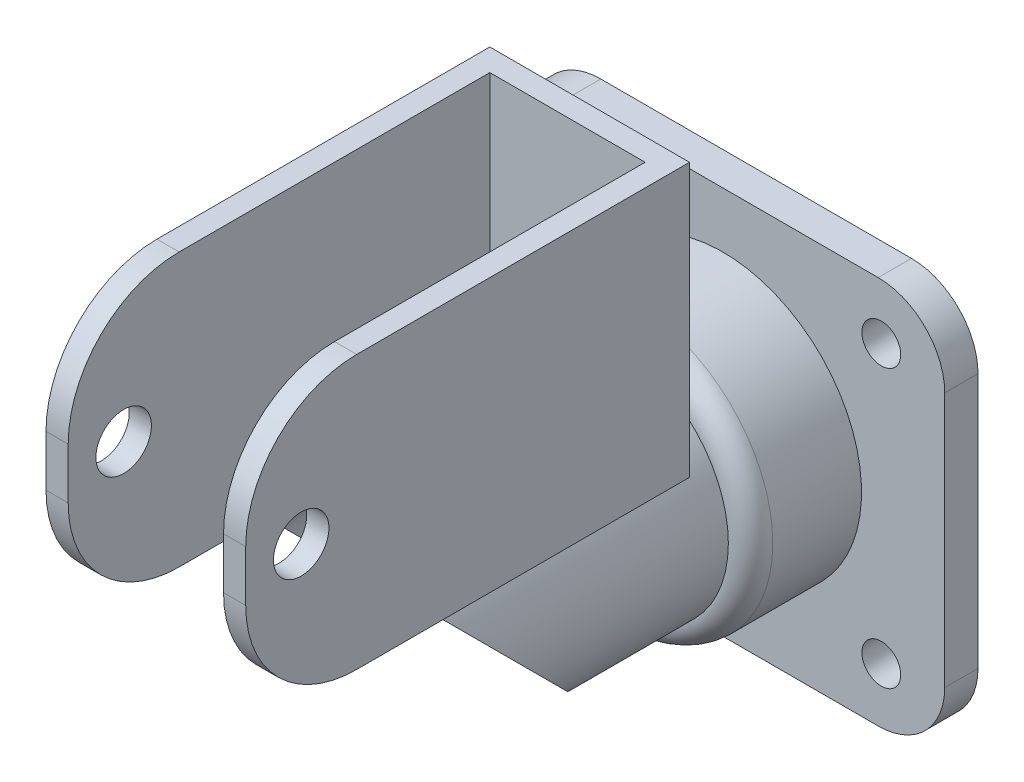
ISO-10303-21;
HEADER;
FILE_DESCRIPTION(('STEP AP214'),'2;1');
FILE_NAME('part.step','',(''),(''),'','','');
FILE_SCHEMA(('AUTOMOTIVE_DESIGN { 1 0 10303 214 1 1 1 1 }'));
ENDSEC;
DATA;
#1=APPLICATION_CONTEXT('core data for automotive mechanical design processes');
#2=APPLICATION_PROTOCOL_DEFINITION('international standard','automotive_design',2000,#1);
#3=PRODUCT_CONTEXT('',#1,'mechanical');
#4=PRODUCT('Part','Part','',(#3));
#5=PRODUCT_RELATED_PRODUCT_CATEGORY('part','',(#4));
#6=PRODUCT_DEFINITION_FORMATION('','',#4);
#7=PRODUCT_DEFINITION_CONTEXT('part definition',#1,'design');
#8=PRODUCT_DEFINITION('design','',#6,#7);
#9=PRODUCT_DEFINITION_SHAPE('','',#8);
#10=(LENGTH_UNIT() NAMED_UNIT(*) SI_UNIT(.MILLI.,.METRE.));
#11=(NAMED_UNIT(*) PLANE_ANGLE_UNIT() SI_UNIT($,.RADIAN.));
#12=(NAMED_UNIT(*) SI_UNIT($,.STERADIAN.) SOLID_ANGLE_UNIT());
#13=UNCERTAINTY_MEASURE_WITH_UNIT(LENGTH_MEASURE(1.E-05),#10,'distance_accuracy_value','');
#14=(GEOMETRIC_REPRESENTATION_CONTEXT(3) GLOBAL_UNCERTAINTY_ASSIGNED_CONTEXT((#13)) GLOBAL_UNIT_ASSIGNED_CONTEXT((#10,
#11,#12)) REPRESENTATION_CONTEXT('',''));
#15=CARTESIAN_POINT('',(0.,0.,0.));
#16=DIRECTION('',(0.,0.,1.));
#17=DIRECTION('',(1.,0.,0.));
#18=AXIS2_PLACEMENT_3D('',#15,#16,#17);
#19=CARTESIAN_POINT('',(-9.,1.99999999999999,55.));
#20=DIRECTION('',(0.,0.,1.));
#21=DIRECTION('',(1.,0.,0.));
#22=AXIS2_PLACEMENT_3D('',#19,#20,#21);
#23=PLANE('',#22);
#24=DIRECTION('',(0.,1.,0.));
#25=VECTOR('',#24,1.);
#26=CARTESIAN_POINT('',(-7.,1.99999999999999,55.));
#27=LINE('',#26,#25);
#28=CARTESIAN_POINT('',(-7.,15.408326913196,55.));
#29=VERTEX_POINT('',#28);
#30=CARTESIAN_POINT('',(-7.,20.,55.));
#31=VERTEX_POINT('',#30);
#32=EDGE_CURVE('E243',#29,#31,#27,.T.);
#33=ORIENTED_EDGE('',*,*,#32,.T.);
#34=DIRECTION('',(1.,0.,0.));
#35=VECTOR('',#34,1.);
#36=CARTESIAN_POINT('',(-9.,20.,55.));
#37=LINE('',#36,#35);
#38=CARTESIAN_POINT('',(-9.,20.,55.));
#39=VERTEX_POINT('',#38);
#40=EDGE_CURVE('E397',#31,#39,#37,.F.);
#41=ORIENTED_EDGE('',*,*,#40,.T.);
#42=DIRECTION('',(0.,1.,0.));
#43=VECTOR('',#42,1.);
#44=CARTESIAN_POINT('',(-9.,1.99999999999999,55.));
#45=LINE('',#44,#43);
#46=CARTESIAN_POINT('',(-9.,15.408326913196,55.));
#47=VERTEX_POINT('',#46);
#48=EDGE_CURVE('E271',#47,#39,#45,.T.);
#49=ORIENTED_EDGE('',*,*,#48,.F.);
#50=DIRECTION('',(1.,0.,0.));
#51=VECTOR('',#50,1.);
#52=CARTESIAN_POINT('',(-9.,15.408326913196,55.));
#53=LINE('',#52,#51);
#54=EDGE_CURVE('E394',#47,#29,#53,.T.);
#55=ORIENTED_EDGE('',*,*,#54,.T.);
#56=EDGE_LOOP('',(#33,#41,#49,#55));
#57=FACE_BOUND('',#56,.T.);
#58=ADVANCED_FACE('F40',(#57),#23,.T.);
#59=CARTESIAN_POINT('',(-20.,5.40832691319601,0.));
#60=DIRECTION('',(0.,-1.,0.));
#61=DIRECTION('',(0.,0.,-1.));
#62=AXIS2_PLACEMENT_3D('',#59,#60,#61);
#63=PLANE('',#62);
#64=DIRECTION('',(0.,0.,-1.));
#65=VECTOR('',#64,1.);
#66=CARTESIAN_POINT('',(8.99999999999999,5.40832691319601,15.));
#67=LINE('',#66,#65);
#68=CARTESIAN_POINT('',(9.,5.40832691319599,45.));
#69=VERTEX_POINT('',#68);
#70=CARTESIAN_POINT('',(8.99999999999999,5.408326913196,37.2220354121809));
#71=VERTEX_POINT('',#70);
#72=EDGE_CURVE('E258',#69,#71,#67,.T.);
#73=ORIENTED_EDGE('',*,*,#72,.F.);
#74=DIRECTION('',(1.,0.,0.));
#75=VECTOR('',#74,1.);
#76=CARTESIAN_POINT('',(-20.,5.40832691319599,45.));
#77=LINE('',#76,#75);
#78=CARTESIAN_POINT('',(7.,5.40832691319599,45.));
#79=VERTEX_POINT('',#78);
#80=EDGE_CURVE('E49',#69,#79,#77,.F.);
#81=ORIENTED_EDGE('',*,*,#80,.T.);
#82=DIRECTION('',(0.,0.,-1.));
#83=VECTOR('',#82,1.);
#84=CARTESIAN_POINT('',(6.99999999999999,5.40832691319601,15.));
#85=LINE('',#84,#83);
#86=CARTESIAN_POINT('',(7.,5.408326913196,37.2220354121809));
#87=VERTEX_POINT('',#86);
#88=EDGE_CURVE('E239',#79,#87,#85,.T.);
#89=ORIENTED_EDGE('',*,*,#88,.T.);
#90=DIRECTION('',(1.,0.,0.));
#91=VECTOR('',#90,1.);
#92=CARTESIAN_POINT('',(-20.,5.408326913196,37.2220354121809));
#93=LINE('',#92,#91);
#94=EDGE_CURVE('E253',#87,#71,#93,.T.);
#95=ORIENTED_EDGE('',*,*,#94,.T.);
#96=EDGE_LOOP('',(#73,#81,#89,#95));
#97=FACE_BOUND('',#96,.T.);
#98=ADVANCED_FACE('F434',(#97),#63,.T.);
#99=DIRECTION('',(0.,0.,1.));
#100=VECTOR('',#99,1.);
#101=CARTESIAN_POINT('',(-7.00000000000001,5.40832691319601,15.));
#102=LINE('',#101,#100);
#103=CARTESIAN_POINT('',(-7.,5.408326913196,37.2220354121809));
#104=VERTEX_POINT('',#103);
#105=CARTESIAN_POINT('',(-7.,5.40832691319599,45.));
#106=VERTEX_POINT('',#105);
#107=EDGE_CURVE('E235',#104,#106,#102,.T.);
#108=ORIENTED_EDGE('',*,*,#107,.T.);
#109=DIRECTION('',(1.,0.,0.));
#110=VECTOR('',#109,1.);
#111=CARTESIAN_POINT('',(-20.,5.40832691319599,45.));
#112=LINE('',#111,#110);
#113=CARTESIAN_POINT('',(-9.,5.40832691319599,45.));
#114=VERTEX_POINT('',#113);
#115=EDGE_CURVE('E12',#106,#114,#112,.F.);
#116=ORIENTED_EDGE('',*,*,#115,.T.);
#117=DIRECTION('',(0.,0.,1.));
#118=VECTOR('',#117,1.);
#119=CARTESIAN_POINT('',(-9.00000000000001,5.40832691319601,15.));
#120=LINE('',#119,#118);
#121=CARTESIAN_POINT('',(-9.00000000000001,5.408326913196,37.2220354121809));
#122=VERTEX_POINT('',#121);
#123=EDGE_CURVE('E260',#122,#114,#120,.T.);
#124=ORIENTED_EDGE('',*,*,#123,.F.);
#125=EDGE_CURVE('E255',#122,#104,#93,.T.);
#126=ORIENTED_EDGE('',*,*,#125,.T.);
#127=EDGE_LOOP('',(#108,#116,#124,#126));
#128=FACE_BOUND('',#127,.T.);
#129=ADVANCED_FACE('F464',(#128),#63,.T.);
#130=CARTESIAN_POINT('',(-9.00000000000001,1.99999999999999,15.));
#131=DIRECTION('',(-1.,0.,0.));
#132=DIRECTION('',(0.,0.,1.));
#133=AXIS2_PLACEMENT_3D('',#130,#131,#132);
#134=PLANE('',#133);
#135=CARTESIAN_POINT('',(-9.,17.704163456598,50.));
#136=DIRECTION('',(-1.,0.,0.));
#137=DIRECTION('',(0.,0.,1.));
#138=AXIS2_PLACEMENT_3D('',#135,#136,#137);
#139=CIRCLE('',#138,2.5);
#140=CARTESIAN_POINT('',(-9.,17.704163456598,52.5));
#141=VERTEX_POINT('',#140);
#142=EDGE_CURVE('E230',#141,#141,#139,.T.);
#143=ORIENTED_EDGE('',*,*,#142,.F.);
#144=EDGE_LOOP('',(#143));
#145=FACE_BOUND('',#144,.T.);
#146=ORIENTED_EDGE('',*,*,#48,.T.);
#147=CARTESIAN_POINT('',(-9.,20.,45.));
#148=DIRECTION('',(-1.,0.,0.));
#149=DIRECTION('',(0.,0.,1.));
#150=AXIS2_PLACEMENT_3D('',#147,#148,#149);
#151=CIRCLE('',#150,10.);
#152=CARTESIAN_POINT('',(-9.,30.,45.));
#153=VERTEX_POINT('',#152);
#154=EDGE_CURVE('E401',#39,#153,#151,.T.);
#155=ORIENTED_EDGE('',*,*,#154,.T.);
#156=DIRECTION('',(0.,0.,1.));
#157=VECTOR('',#156,1.);
#158=CARTESIAN_POINT('',(-9.00000000000001,30.,15.));
#159=LINE('',#158,#157);
#160=CARTESIAN_POINT('',(-9.00000000000001,30.,15.));
#161=VERTEX_POINT('',#160);
#162=EDGE_CURVE('E263',#161,#153,#159,.T.);
#163=ORIENTED_EDGE('',*,*,#162,.F.);
#164=DIRECTION('',(0.,1.,0.));
#165=VECTOR('',#164,1.);
#166=CARTESIAN_POINT('',(-9.00000000000001,1.99999999999999,15.));
#167=LINE('',#166,#165);
#168=CARTESIAN_POINT('',(-9.00000000000001,5.40832691319597,15.));
#169=VERTEX_POINT('',#168);
#170=EDGE_CURVE('E272',#169,#161,#167,.T.);
#171=ORIENTED_EDGE('',*,*,#170,.F.);
#172=DIRECTION('',(0.,0.,-1.));
#173=VECTOR('',#172,1.);
#174=CARTESIAN_POINT('',(-9.,5.40832691319598,43.));
#175=LINE('',#174,#173);
#176=EDGE_CURVE('E284',#122,#169,#175,.T.);
#177=ORIENTED_EDGE('',*,*,#176,.F.);
#178=ORIENTED_EDGE('',*,*,#123,.T.);
#179=CARTESIAN_POINT('',(-9.,15.408326913196,45.));
#180=DIRECTION('',(-1.,0.,0.));
#181=DIRECTION('',(0.,0.,1.));
#182=AXIS2_PLACEMENT_3D('',#179,#180,#181);
#183=CIRCLE('',#182,10.);
#184=EDGE_CURVE('E399',#114,#47,#183,.T.);
#185=ORIENTED_EDGE('',*,*,#184,.T.);
#186=EDGE_LOOP('',(#146,#155,#163,#171,#177,#178,#185));
#187=FACE_BOUND('',#186,.T.);
#188=ADVANCED_FACE('F465',(#145,#187),#134,.T.);
#189=CARTESIAN_POINT('',(8.99999999999999,1.99999999999999,15.));
#190=DIRECTION('',(1.,0.,0.));
#191=DIRECTION('',(0.,0.,-1.));
#192=AXIS2_PLACEMENT_3D('',#189,#190,#191);
#193=PLANE('',#192);
#194=CARTESIAN_POINT('',(9.,17.704163456598,50.));
#195=DIRECTION('',(1.,0.,0.));
#196=DIRECTION('',(0.,0.,-1.));
#197=AXIS2_PLACEMENT_3D('',#194,#195,#196);
#198=CIRCLE('',#197,2.5);
#199=CARTESIAN_POINT('',(9.,17.704163456598,47.5));
#200=VERTEX_POINT('',#199);
#201=EDGE_CURVE('E810',#200,#200,#198,.T.);
#202=ORIENTED_EDGE('',*,*,#201,.F.);
#203=EDGE_LOOP('',(#202));
#204=FACE_BOUND('',#203,.T.);
#205=DIRECTION('',(0.,0.,-1.));
#206=VECTOR('',#205,1.);
#207=CARTESIAN_POINT('',(8.99999999999999,30.,15.));
#208=LINE('',#207,#206);
#209=CARTESIAN_POINT('',(9.,30.,45.));
#210=VERTEX_POINT('',#209);
#211=CARTESIAN_POINT('',(8.99999999999999,30.,15.));
#212=VERTEX_POINT('',#211);
#213=EDGE_CURVE('E266',#210,#212,#208,.T.);
#214=ORIENTED_EDGE('',*,*,#213,.F.);
#215=CARTESIAN_POINT('',(9.,20.,45.));
#216=DIRECTION('',(1.,0.,0.));
#217=DIRECTION('',(0.,0.,-1.));
#218=AXIS2_PLACEMENT_3D('',#215,#216,#217);
#219=CIRCLE('',#218,10.);
#220=CARTESIAN_POINT('',(9.,20.,55.));
#221=VERTEX_POINT('',#220);
#222=EDGE_CURVE('E405',#210,#221,#219,.T.);
#223=ORIENTED_EDGE('',*,*,#222,.T.);
#224=DIRECTION('',(0.,1.,0.));
#225=VECTOR('',#224,1.);
#226=CARTESIAN_POINT('',(9.,1.99999999999999,55.));
#227=LINE('',#226,#225);
#228=CARTESIAN_POINT('',(9.,15.408326913196,55.));
#229=VERTEX_POINT('',#228);
#230=EDGE_CURVE('E278',#229,#221,#227,.T.);
#231=ORIENTED_EDGE('',*,*,#230,.F.);
#232=CARTESIAN_POINT('',(9.,15.408326913196,45.));
#233=DIRECTION('',(1.,0.,0.));
#234=DIRECTION('',(0.,0.,-1.));
#235=AXIS2_PLACEMENT_3D('',#232,#233,#234);
#236=CIRCLE('',#235,10.);
#237=EDGE_CURVE('E403',#229,#69,#236,.T.);
#238=ORIENTED_EDGE('',*,*,#237,.T.);
#239=ORIENTED_EDGE('',*,*,#72,.T.);
#240=DIRECTION('',(0.,0.,-1.));
#241=VECTOR('',#240,1.);
#242=CARTESIAN_POINT('',(9.,5.40832691319599,43.));
#243=LINE('',#242,#241);
#244=CARTESIAN_POINT('',(8.99999999999999,5.40832691319599,15.));
#245=VERTEX_POINT('',#244);
#246=EDGE_CURVE('E274',#245,#71,#243,.F.);
#247=ORIENTED_EDGE('',*,*,#246,.F.);
#248=DIRECTION('',(0.,1.,0.));
#249=VECTOR('',#248,1.);
#250=CARTESIAN_POINT('',(8.99999999999999,1.99999999999999,15.));
#251=LINE('',#250,#249);
#252=EDGE_CURVE('E275',#245,#212,#251,.T.);
#253=ORIENTED_EDGE('',*,*,#252,.T.);
#254=EDGE_LOOP('',(#214,#223,#231,#238,#239,#247,#253));
#255=FACE_BOUND('',#254,.T.);
#256=ADVANCED_FACE('F427',(#204,#255),#193,.T.);
#257=ORIENTED_EDGE('',*,*,#230,.T.);
#258=DIRECTION('',(1.,0.,0.));
#259=VECTOR('',#258,1.);
#260=CARTESIAN_POINT('',(-9.,20.,55.));
#261=LINE('',#260,#259);
#262=CARTESIAN_POINT('',(7.,20.,55.));
#263=VERTEX_POINT('',#262);
#264=EDGE_CURVE('E63',#221,#263,#261,.F.);
#265=ORIENTED_EDGE('',*,*,#264,.T.);
#266=DIRECTION('',(0.,1.,0.));
#267=VECTOR('',#266,1.);
#268=CARTESIAN_POINT('',(7.,1.99999999999999,55.));
#269=LINE('',#268,#267);
#270=CARTESIAN_POINT('',(7.,15.408326913196,55.));
#271=VERTEX_POINT('',#270);
#272=EDGE_CURVE('E234',#271,#263,#269,.T.);
#273=ORIENTED_EDGE('',*,*,#272,.F.);
#274=DIRECTION('',(1.,0.,0.));
#275=VECTOR('',#274,1.);
#276=CARTESIAN_POINT('',(-9.,15.408326913196,55.));
#277=LINE('',#276,#275);
#278=EDGE_CURVE('E407',#271,#229,#277,.T.);
#279=ORIENTED_EDGE('',*,*,#278,.T.);
#280=EDGE_LOOP('',(#257,#265,#273,#279));
#281=FACE_BOUND('',#280,.T.);
#282=ADVANCED_FACE('F428',(#281),#23,.T.);
#283=CARTESIAN_POINT('',(0.,0.,43.));
#284=DIRECTION('',(0.,0.,-1.));
#285=DIRECTION('',(-1.,0.,0.));
#286=AXIS2_PLACEMENT_3D('',#283,#284,#285);
#287=CYLINDRICAL_SURFACE('',#286,10.5);
#288=CARTESIAN_POINT('',(0.,0.,13.));
#289=DIRECTION('',(0.,0.,1.));
#290=DIRECTION('',(1.,0.,0.));
#291=AXIS2_PLACEMENT_3D('',#288,#289,#290);
#292=CIRCLE('',#291,10.5);
#293=CARTESIAN_POINT('',(10.5,0.,13.));
#294=VERTEX_POINT('',#293);
#295=EDGE_CURVE('E372',#294,#294,#292,.T.);
#296=ORIENTED_EDGE('',*,*,#295,.T.);
#297=EDGE_LOOP('',(#296));
#298=FACE_BOUND('',#297,.T.);
#299=CARTESIAN_POINT('',(0.,0.,31.8137084989849));
#300=DIRECTION('',(0.,-0.707106781186549,0.707106781186546));
#301=DIRECTION('',(0.,-0.707106781186546,-0.707106781186549));
#302=AXIS2_PLACEMENT_3D('',#299,#300,#301);
#303=ELLIPSE('',#302,14.8492424049175,10.5);
#304=EDGE_CURVE('E378',#122,#71,#303,.T.);
#305=ORIENTED_EDGE('',*,*,#304,.F.);
#306=ORIENTED_EDGE('',*,*,#176,.T.);
#307=CARTESIAN_POINT('',(0.,0.,15.));
#308=DIRECTION('',(0.,0.,-1.));
#309=DIRECTION('',(-1.,0.,0.));
#310=AXIS2_PLACEMENT_3D('',#307,#308,#309);
#311=CIRCLE('',#310,10.5);
#312=EDGE_CURVE('E381',#169,#245,#311,.T.);
#313=ORIENTED_EDGE('',*,*,#312,.T.);
#314=ORIENTED_EDGE('',*,*,#246,.T.);
#315=EDGE_LOOP('',(#305,#306,#313,#314));
#316=FACE_BOUND('',#315,.T.);
#317=ADVANCED_FACE('F443',(#298,#316),#287,.T.);
#318=CARTESIAN_POINT('',(14.,11.5,3.));
#319=DIRECTION('',(0.,0.,-1.));
#320=DIRECTION('',(-1.,0.,0.));
#321=AXIS2_PLACEMENT_3D('',#318,#319,#320);
#322=PLANE('',#321);
#323=CARTESIAN_POINT('',(0.,0.,3.));
#324=DIRECTION('',(0.,0.,-1.));
#325=DIRECTION('',(-1.,0.,0.));
#326=AXIS2_PLACEMENT_3D('',#323,#324,#325);
#327=CIRCLE('',#326,12.5);
#328=CARTESIAN_POINT('',(-12.5,0.,3.));
#329=VERTEX_POINT('',#328);
#330=EDGE_CURVE('E369',#329,#329,#327,.F.);
#331=ORIENTED_EDGE('',*,*,#330,.F.);
#332=EDGE_LOOP('',(#331));
#333=FACE_BOUND('',#332,.T.);
#334=CARTESIAN_POINT('',(14.,11.5,3.));
#335=DIRECTION('',(0.,0.,1.));
#336=DIRECTION('',(-1.,0.,0.));
#337=AXIS2_PLACEMENT_3D('',#334,#335,#336);
#338=CIRCLE('',#337,6.);
#339=CARTESIAN_POINT('',(20.,11.5,3.));
#340=VERTEX_POINT('',#339);
#341=CARTESIAN_POINT('',(14.,17.5,3.));
#342=VERTEX_POINT('',#341);
#343=EDGE_CURVE('E312',#340,#342,#338,.T.);
#344=ORIENTED_EDGE('',*,*,#343,.T.);
#345=DIRECTION('',(-1.,0.,0.));
#346=VECTOR('',#345,1.);
#347=CARTESIAN_POINT('',(-14.,17.5,3.));
#348=LINE('',#347,#346);
#349=CARTESIAN_POINT('',(-14.,17.5,3.));
#350=VERTEX_POINT('',#349);
#351=EDGE_CURVE('E315',#342,#350,#348,.T.);
#352=ORIENTED_EDGE('',*,*,#351,.T.);
#353=CARTESIAN_POINT('',(-14.,11.5,3.));
#354=DIRECTION('',(0.,0.,1.));
#355=DIRECTION('',(-1.,0.,0.));
#356=AXIS2_PLACEMENT_3D('',#353,#354,#355);
#357=CIRCLE('',#356,6.);
#358=CARTESIAN_POINT('',(-20.,11.5,3.));
#359=VERTEX_POINT('',#358);
#360=EDGE_CURVE('E318',#350,#359,#357,.T.);
#361=ORIENTED_EDGE('',*,*,#360,.T.);
#362=DIRECTION('',(0.,-1.,0.));
#363=VECTOR('',#362,1.);
#364=CARTESIAN_POINT('',(-20.,-11.5,3.));
#365=LINE('',#364,#363);
#366=CARTESIAN_POINT('',(-20.,-11.5,3.));
#367=VERTEX_POINT('',#366);
#368=EDGE_CURVE('E320',#359,#367,#365,.T.);
#369=ORIENTED_EDGE('',*,*,#368,.T.);
#370=CARTESIAN_POINT('',(-14.,-11.5,3.));
#371=DIRECTION('',(0.,0.,1.));
#372=DIRECTION('',(-1.,0.,0.));
#373=AXIS2_PLACEMENT_3D('',#370,#371,#372);
#374=CIRCLE('',#373,6.);
#375=CARTESIAN_POINT('',(-14.,-17.5,3.));
#376=VERTEX_POINT('',#375);
#377=EDGE_CURVE('E322',#367,#376,#374,.T.);
#378=ORIENTED_EDGE('',*,*,#377,.T.);
#379=DIRECTION('',(1.,0.,0.));
#380=VECTOR('',#379,1.);
#381=CARTESIAN_POINT('',(-14.,-17.5,3.));
#382=LINE('',#381,#380);
#383=CARTESIAN_POINT('',(14.,-17.5,3.));
#384=VERTEX_POINT('',#383);
#385=EDGE_CURVE('E324',#376,#384,#382,.T.);
#386=ORIENTED_EDGE('',*,*,#385,.T.);
#387=CARTESIAN_POINT('',(14.,-11.5,3.));
#388=DIRECTION('',(0.,0.,1.));
#389=DIRECTION('',(1.,0.,0.));
#390=AXIS2_PLACEMENT_3D('',#387,#388,#389);
#391=CIRCLE('',#390,6.);
#392=CARTESIAN_POINT('',(20.,-11.5,3.));
#393=VERTEX_POINT('',#392);
#394=EDGE_CURVE('E326',#384,#393,#391,.T.);
#395=ORIENTED_EDGE('',*,*,#394,.T.);
#396=DIRECTION('',(0.,1.,0.));
#397=VECTOR('',#396,1.);
#398=CARTESIAN_POINT('',(20.,-11.5,3.));
#399=LINE('',#398,#397);
#400=EDGE_CURVE('E328',#393,#340,#399,.T.);
#401=ORIENTED_EDGE('',*,*,#400,.T.);
#402=EDGE_LOOP('',(#344,#352,#361,#369,#378,#386,#395,#401));
#403=FACE_BOUND('',#402,.T.);
#404=CARTESIAN_POINT('',(-14.2857142857143,12.5,3.));
#405=DIRECTION('',(0.,0.,1.));
#406=DIRECTION('',(1.,0.,0.));
#407=AXIS2_PLACEMENT_3D('',#404,#405,#406);
#408=CIRCLE('',#407,1.75);
#409=CARTESIAN_POINT('',(-12.5357142857143,12.5,3.));
#410=VERTEX_POINT('',#409);
#411=EDGE_CURVE('E306',#410,#410,#408,.T.);
#412=ORIENTED_EDGE('',*,*,#411,.F.);
#413=EDGE_LOOP('',(#412));
#414=FACE_BOUND('',#413,.T.);
#415=CARTESIAN_POINT('',(-14.2857142857143,-12.5,3.));
#416=DIRECTION('',(0.,0.,1.));
#417=DIRECTION('',(1.,0.,0.));
#418=AXIS2_PLACEMENT_3D('',#415,#416,#417);
#419=CIRCLE('',#418,1.75);
#420=CARTESIAN_POINT('',(-12.5357142857143,-12.5,3.));
#421=VERTEX_POINT('',#420);
#422=EDGE_CURVE('E300',#421,#421,#419,.T.);
#423=ORIENTED_EDGE('',*,*,#422,.F.);
#424=EDGE_LOOP('',(#423));
#425=FACE_BOUND('',#424,.T.);
#426=CARTESIAN_POINT('',(14.2857142857143,-12.5,3.));
#427=DIRECTION('',(0.,0.,1.));
#428=DIRECTION('',(1.,0.,0.));
#429=AXIS2_PLACEMENT_3D('',#426,#427,#428);
#430=CIRCLE('',#429,1.75);
#431=CARTESIAN_POINT('',(16.0357142857143,-12.5,3.));
#432=VERTEX_POINT('',#431);
#433=EDGE_CURVE('E294',#432,#432,#430,.T.);
#434=ORIENTED_EDGE('',*,*,#433,.F.);
#435=EDGE_LOOP('',(#434));
#436=FACE_BOUND('',#435,.T.);
#437=CARTESIAN_POINT('',(14.2857142857143,12.5,3.));
#438=DIRECTION('',(0.,0.,1.));
#439=DIRECTION('',(1.,0.,0.));
#440=AXIS2_PLACEMENT_3D('',#437,#438,#439);
#441=CIRCLE('',#440,1.75);
#442=CARTESIAN_POINT('',(16.0357142857143,12.5,3.));
#443=VERTEX_POINT('',#442);
#444=EDGE_CURVE('E288',#443,#443,#441,.T.);
#445=ORIENTED_EDGE('',*,*,#444,.F.);
#446=EDGE_LOOP('',(#445));
#447=FACE_BOUND('',#446,.T.);
#448=ADVANCED_FACE('F487',(#333,#403,#414,#425,#436,#447),#322,.F.);
#449=CARTESIAN_POINT('',(14.,11.5,0.));
#450=DIRECTION('',(0.,0.,-1.));
#451=DIRECTION('',(-1.,0.,0.));
#452=AXIS2_PLACEMENT_3D('',#449,#450,#451);
#453=PLANE('',#452);
#454=CARTESIAN_POINT('',(14.2857142857143,-12.5,0.));
#455=DIRECTION('',(0.,0.,1.));
#456=DIRECTION('',(1.,0.,0.));
#457=AXIS2_PLACEMENT_3D('',#454,#455,#456);
#458=CIRCLE('',#457,1.75);
#459=CARTESIAN_POINT('',(16.0357142857143,-12.5,0.));
#460=VERTEX_POINT('',#459);
#461=EDGE_CURVE('E291',#460,#460,#458,.T.);
#462=ORIENTED_EDGE('',*,*,#461,.T.);
#463=EDGE_LOOP('',(#462));
#464=FACE_BOUND('',#463,.T.);
#465=CARTESIAN_POINT('',(-14.2857142857143,12.5,0.));
#466=DIRECTION('',(0.,0.,1.));
#467=DIRECTION('',(1.,0.,0.));
#468=AXIS2_PLACEMENT_3D('',#465,#466,#467);
#469=CIRCLE('',#468,1.75);
#470=CARTESIAN_POINT('',(-12.5357142857143,12.5,0.));
#471=VERTEX_POINT('',#470);
#472=EDGE_CURVE('E303',#471,#471,#469,.T.);
#473=ORIENTED_EDGE('',*,*,#472,.T.);
#474=EDGE_LOOP('',(#473));
#475=FACE_BOUND('',#474,.T.);
#476=CARTESIAN_POINT('',(14.,11.5,0.));
#477=DIRECTION('',(0.,0.,1.));
#478=DIRECTION('',(-1.,0.,0.));
#479=AXIS2_PLACEMENT_3D('',#476,#477,#478);
#480=CIRCLE('',#479,6.);
#481=CARTESIAN_POINT('',(20.,11.5,0.));
#482=VERTEX_POINT('',#481);
#483=CARTESIAN_POINT('',(14.,17.5,0.));
#484=VERTEX_POINT('',#483);
#485=EDGE_CURVE('E309',#482,#484,#480,.T.);
#486=ORIENTED_EDGE('',*,*,#485,.F.);
#487=DIRECTION('',(0.,1.,0.));
#488=VECTOR('',#487,1.);
#489=CARTESIAN_POINT('',(20.,-11.5,0.));
#490=LINE('',#489,#488);
#491=CARTESIAN_POINT('',(20.,-11.5,0.));
#492=VERTEX_POINT('',#491);
#493=EDGE_CURVE('E316',#492,#482,#490,.T.);
#494=ORIENTED_EDGE('',*,*,#493,.F.);
#495=CARTESIAN_POINT('',(14.,-11.5,0.));
#496=DIRECTION('',(0.,0.,1.));
#497=DIRECTION('',(1.,0.,0.));
#498=AXIS2_PLACEMENT_3D('',#495,#496,#497);
#499=CIRCLE('',#498,6.);
#500=CARTESIAN_POINT('',(14.,-17.5,0.));
#501=VERTEX_POINT('',#500);
#502=EDGE_CURVE('E343',#501,#492,#499,.T.);
#503=ORIENTED_EDGE('',*,*,#502,.F.);
#504=DIRECTION('',(1.,0.,0.));
#505=VECTOR('',#504,1.);
#506=CARTESIAN_POINT('',(-14.,-17.5,0.));
#507=LINE('',#506,#505);
#508=CARTESIAN_POINT('',(-14.,-17.5,0.));
#509=VERTEX_POINT('',#508);
#510=EDGE_CURVE('E341',#509,#501,#507,.T.);
#511=ORIENTED_EDGE('',*,*,#510,.F.);
#512=CARTESIAN_POINT('',(-14.,-11.5,0.));
#513=DIRECTION('',(0.,0.,1.));
#514=DIRECTION('',(-1.,0.,0.));
#515=AXIS2_PLACEMENT_3D('',#512,#513,#514);
#516=CIRCLE('',#515,6.);
#517=CARTESIAN_POINT('',(-20.,-11.5,0.));
#518=VERTEX_POINT('',#517);
#519=EDGE_CURVE('E339',#518,#509,#516,.T.);
#520=ORIENTED_EDGE('',*,*,#519,.F.);
#521=DIRECTION('',(0.,-1.,0.));
#522=VECTOR('',#521,1.);
#523=CARTESIAN_POINT('',(-20.,-11.5,0.));
#524=LINE('',#523,#522);
#525=CARTESIAN_POINT('',(-20.,11.5,0.));
#526=VERTEX_POINT('',#525);
#527=EDGE_CURVE('E337',#526,#518,#524,.T.);
#528=ORIENTED_EDGE('',*,*,#527,.F.);
#529=CARTESIAN_POINT('',(-14.,11.5,0.));
#530=DIRECTION('',(0.,0.,1.));
#531=DIRECTION('',(-1.,0.,0.));
#532=AXIS2_PLACEMENT_3D('',#529,#530,#531);
#533=CIRCLE('',#532,6.);
#534=CARTESIAN_POINT('',(-14.,17.5,0.));
#535=VERTEX_POINT('',#534);
#536=EDGE_CURVE('E335',#535,#526,#533,.T.);
#537=ORIENTED_EDGE('',*,*,#536,.F.);
#538=DIRECTION('',(-1.,0.,0.));
#539=VECTOR('',#538,1.);
#540=CARTESIAN_POINT('',(-14.,17.5,0.));
#541=LINE('',#540,#539);
#542=EDGE_CURVE('E333',#484,#535,#541,.T.);
#543=ORIENTED_EDGE('',*,*,#542,.F.);
#544=EDGE_LOOP('',(#486,#494,#503,#511,#520,#528,#537,#543));
#545=FACE_BOUND('',#544,.T.);
#546=CARTESIAN_POINT('',(-14.2857142857143,-12.5,0.));
#547=DIRECTION('',(0.,0.,1.));
#548=DIRECTION('',(1.,0.,0.));
#549=AXIS2_PLACEMENT_3D('',#546,#547,#548);
#550=CIRCLE('',#549,1.75);
#551=CARTESIAN_POINT('',(-12.5357142857143,-12.5,0.));
#552=VERTEX_POINT('',#551);
#553=EDGE_CURVE('E297',#552,#552,#550,.T.);
#554=ORIENTED_EDGE('',*,*,#553,.T.);
#555=EDGE_LOOP('',(#554));
#556=FACE_BOUND('',#555,.T.);
#557=CARTESIAN_POINT('',(14.2857142857143,12.5,0.));
#558=DIRECTION('',(0.,0.,1.));
#559=DIRECTION('',(1.,0.,0.));
#560=AXIS2_PLACEMENT_3D('',#557,#558,#559);
#561=CIRCLE('',#560,1.75);
#562=CARTESIAN_POINT('',(16.0357142857143,12.5,0.));
#563=VERTEX_POINT('',#562);
#564=EDGE_CURVE('E287',#563,#563,#561,.T.);
#565=ORIENTED_EDGE('',*,*,#564,.T.);
#566=EDGE_LOOP('',(#565));
#567=FACE_BOUND('',#566,.T.);
#568=ADVANCED_FACE('F493',(#464,#475,#545,#556,#567),#453,.T.);
#569=CARTESIAN_POINT('',(14.,11.5,3.));
#570=DIRECTION('',(0.,0.,-1.));
#571=DIRECTION('',(-1.,0.,0.));
#572=AXIS2_PLACEMENT_3D('',#569,#570,#571);
#573=CYLINDRICAL_SURFACE('',#572,6.);
#574=ORIENTED_EDGE('',*,*,#485,.T.);
#575=DIRECTION('',(0.,0.,-1.));
#576=VECTOR('',#575,1.);
#577=CARTESIAN_POINT('',(14.,17.5,3.));
#578=LINE('',#577,#576);
#579=EDGE_CURVE('E366',#342,#484,#578,.T.);
#580=ORIENTED_EDGE('',*,*,#579,.F.);
#581=ORIENTED_EDGE('',*,*,#343,.F.);
#582=DIRECTION('',(0.,0.,-1.));
#583=VECTOR('',#582,1.);
#584=CARTESIAN_POINT('',(20.,11.5,3.));
#585=LINE('',#584,#583);
#586=EDGE_CURVE('E330',#340,#482,#585,.T.);
#587=ORIENTED_EDGE('',*,*,#586,.T.);
#588=EDGE_LOOP('',(#574,#580,#581,#587));
#589=FACE_BOUND('',#588,.T.);
#590=ADVANCED_FACE('F521',(#589),#573,.T.);
#591=CARTESIAN_POINT('',(-14.,17.5,3.));
#592=DIRECTION('',(0.,-1.,0.));
#593=DIRECTION('',(0.,0.,-1.));
#594=AXIS2_PLACEMENT_3D('',#591,#592,#593);
#595=PLANE('',#594);
#596=ORIENTED_EDGE('',*,*,#542,.T.);
#597=DIRECTION('',(0.,0.,-1.));
#598=VECTOR('',#597,1.);
#599=CARTESIAN_POINT('',(-14.,17.5,3.));
#600=LINE('',#599,#598);
#601=EDGE_CURVE('E363',#350,#535,#600,.T.);
#602=ORIENTED_EDGE('',*,*,#601,.F.);
#603=ORIENTED_EDGE('',*,*,#351,.F.);
#604=ORIENTED_EDGE('',*,*,#579,.T.);
#605=EDGE_LOOP('',(#596,#602,#603,#604));
#606=FACE_BOUND('',#605,.T.);
#607=ADVANCED_FACE('F545',(#606),#595,.F.);
#608=CARTESIAN_POINT('',(-14.,11.5,3.));
#609=DIRECTION('',(0.,0.,-1.));
#610=DIRECTION('',(-1.,0.,0.));
#611=AXIS2_PLACEMENT_3D('',#608,#609,#610);
#612=CYLINDRICAL_SURFACE('',#611,6.);
#613=ORIENTED_EDGE('',*,*,#536,.T.);
#614=DIRECTION('',(0.,0.,-1.));
#615=VECTOR('',#614,1.);
#616=CARTESIAN_POINT('',(-20.,11.5,3.));
#617=LINE('',#616,#615);
#618=EDGE_CURVE('E360',#359,#526,#617,.T.);
#619=ORIENTED_EDGE('',*,*,#618,.F.);
#620=ORIENTED_EDGE('',*,*,#360,.F.);
#621=ORIENTED_EDGE('',*,*,#601,.T.);
#622=EDGE_LOOP('',(#613,#619,#620,#621));
#623=FACE_BOUND('',#622,.T.);
#624=ADVANCED_FACE('F541',(#623),#612,.T.);
#625=CARTESIAN_POINT('',(-20.,-11.5,3.));
#626=DIRECTION('',(1.,0.,0.));
#627=DIRECTION('',(0.,0.,-1.));
#628=AXIS2_PLACEMENT_3D('',#625,#626,#627);
#629=PLANE('',#628);
#630=ORIENTED_EDGE('',*,*,#527,.T.);
#631=DIRECTION('',(0.,0.,-1.));
#632=VECTOR('',#631,1.);
#633=CARTESIAN_POINT('',(-20.,-11.5,3.));
#634=LINE('',#633,#632);
#635=EDGE_CURVE('E357',#367,#518,#634,.T.);
#636=ORIENTED_EDGE('',*,*,#635,.F.);
#637=ORIENTED_EDGE('',*,*,#368,.F.);
#638=ORIENTED_EDGE('',*,*,#618,.T.);
#639=EDGE_LOOP('',(#630,#636,#637,#638));
#640=FACE_BOUND('',#639,.T.);
#641=ADVANCED_FACE('F537',(#640),#629,.F.);
#642=CARTESIAN_POINT('',(-14.,-11.5,3.));
#643=DIRECTION('',(0.,0.,-1.));
#644=DIRECTION('',(-1.,0.,0.));
#645=AXIS2_PLACEMENT_3D('',#642,#643,#644);
#646=CYLINDRICAL_SURFACE('',#645,6.);
#647=ORIENTED_EDGE('',*,*,#519,.T.);
#648=DIRECTION('',(0.,0.,-1.));
#649=VECTOR('',#648,1.);
#650=CARTESIAN_POINT('',(-14.,-17.5,3.));
#651=LINE('',#650,#649);
#652=EDGE_CURVE('E354',#376,#509,#651,.T.);
#653=ORIENTED_EDGE('',*,*,#652,.F.);
#654=ORIENTED_EDGE('',*,*,#377,.F.);
#655=ORIENTED_EDGE('',*,*,#635,.T.);
#656=EDGE_LOOP('',(#647,#653,#654,#655));
#657=FACE_BOUND('',#656,.T.);
#658=ADVANCED_FACE('F533',(#657),#646,.T.);
#659=CARTESIAN_POINT('',(-14.,-17.5,3.));
#660=DIRECTION('',(0.,1.,0.));
#661=DIRECTION('',(0.,0.,1.));
#662=AXIS2_PLACEMENT_3D('',#659,#660,#661);
#663=PLANE('',#662);
#664=ORIENTED_EDGE('',*,*,#510,.T.);
#665=DIRECTION('',(0.,0.,-1.));
#666=VECTOR('',#665,1.);
#667=CARTESIAN_POINT('',(14.,-17.5,3.));
#668=LINE('',#667,#666);
#669=EDGE_CURVE('E351',#384,#501,#668,.T.);
#670=ORIENTED_EDGE('',*,*,#669,.F.);
#671=ORIENTED_EDGE('',*,*,#385,.F.);
#672=ORIENTED_EDGE('',*,*,#652,.T.);
#673=EDGE_LOOP('',(#664,#670,#671,#672));
#674=FACE_BOUND('',#673,.T.);
#675=ADVANCED_FACE('F529',(#674),#663,.F.);
#676=CARTESIAN_POINT('',(14.,-11.5,3.));
#677=DIRECTION('',(0.,0.,-1.));
#678=DIRECTION('',(-1.,0.,0.));
#679=AXIS2_PLACEMENT_3D('',#676,#677,#678);
#680=CYLINDRICAL_SURFACE('',#679,6.);
#681=ORIENTED_EDGE('',*,*,#502,.T.);
#682=DIRECTION('',(0.,0.,-1.));
#683=VECTOR('',#682,1.);
#684=CARTESIAN_POINT('',(20.,-11.5,3.));
#685=LINE('',#684,#683);
#686=EDGE_CURVE('E348',#393,#492,#685,.T.);
#687=ORIENTED_EDGE('',*,*,#686,.F.);
#688=ORIENTED_EDGE('',*,*,#394,.F.);
#689=ORIENTED_EDGE('',*,*,#669,.T.);
#690=EDGE_LOOP('',(#681,#687,#688,#689));
#691=FACE_BOUND('',#690,.T.);
#692=ADVANCED_FACE('F525',(#691),#680,.T.);
#693=CARTESIAN_POINT('',(20.,-11.5,3.));
#694=DIRECTION('',(-1.,0.,0.));
#695=DIRECTION('',(0.,0.,1.));
#696=AXIS2_PLACEMENT_3D('',#693,#694,#695);
#697=PLANE('',#696);
#698=ORIENTED_EDGE('',*,*,#493,.T.);
#699=ORIENTED_EDGE('',*,*,#586,.F.);
#700=ORIENTED_EDGE('',*,*,#400,.F.);
#701=ORIENTED_EDGE('',*,*,#686,.T.);
#702=EDGE_LOOP('',(#698,#699,#700,#701));
#703=FACE_BOUND('',#702,.T.);
#704=ADVANCED_FACE('F516',(#703),#697,.F.);
#705=CARTESIAN_POINT('',(-14.2857142857143,12.5,3.));
#706=DIRECTION('',(0.,0.,-1.));
#707=DIRECTION('',(-1.,0.,0.));
#708=AXIS2_PLACEMENT_3D('',#705,#706,#707);
#709=CYLINDRICAL_SURFACE('',#708,1.75);
#710=ORIENTED_EDGE('',*,*,#411,.T.);
#711=EDGE_LOOP('',(#710));
#712=FACE_BOUND('',#711,.T.);
#713=ORIENTED_EDGE('',*,*,#472,.F.);
#714=EDGE_LOOP('',(#713));
#715=FACE_BOUND('',#714,.T.);
#716=ADVANCED_FACE('F513',(#712,#715),#709,.F.);
#717=CARTESIAN_POINT('',(-14.2857142857143,-12.5,3.));
#718=DIRECTION('',(0.,0.,-1.));
#719=DIRECTION('',(-1.,0.,0.));
#720=AXIS2_PLACEMENT_3D('',#717,#718,#719);
#721=CYLINDRICAL_SURFACE('',#720,1.75);
#722=ORIENTED_EDGE('',*,*,#422,.T.);
#723=EDGE_LOOP('',(#722));
#724=FACE_BOUND('',#723,.T.);
#725=ORIENTED_EDGE('',*,*,#553,.F.);
#726=EDGE_LOOP('',(#725));
#727=FACE_BOUND('',#726,.T.);
#728=ADVANCED_FACE('F509',(#724,#727),#721,.F.);
#729=CARTESIAN_POINT('',(14.2857142857143,-12.5,3.));
#730=DIRECTION('',(0.,0.,-1.));
#731=DIRECTION('',(-1.,0.,0.));
#732=AXIS2_PLACEMENT_3D('',#729,#730,#731);
#733=CYLINDRICAL_SURFACE('',#732,1.75);
#734=ORIENTED_EDGE('',*,*,#433,.T.);
#735=EDGE_LOOP('',(#734));
#736=FACE_BOUND('',#735,.T.);
#737=ORIENTED_EDGE('',*,*,#461,.F.);
#738=EDGE_LOOP('',(#737));
#739=FACE_BOUND('',#738,.T.);
#740=ADVANCED_FACE('F505',(#736,#739),#733,.F.);
#741=CARTESIAN_POINT('',(14.2857142857143,12.5,3.));
#742=DIRECTION('',(0.,0.,-1.));
#743=DIRECTION('',(-1.,0.,0.));
#744=AXIS2_PLACEMENT_3D('',#741,#742,#743);
#745=CYLINDRICAL_SURFACE('',#744,1.75);
#746=ORIENTED_EDGE('',*,*,#444,.T.);
#747=EDGE_LOOP('',(#746));
#748=FACE_BOUND('',#747,.T.);
#749=ORIENTED_EDGE('',*,*,#564,.F.);
#750=EDGE_LOOP('',(#749));
#751=FACE_BOUND('',#750,.T.);
#752=ADVANCED_FACE('F501',(#748,#751),#745,.F.);
#753=CARTESIAN_POINT('',(0.,0.,13.));
#754=DIRECTION('',(0.,0.,-1.));
#755=DIRECTION('',(-1.,0.,0.));
#756=AXIS2_PLACEMENT_3D('',#753,#754,#755);
#757=CYLINDRICAL_SURFACE('',#756,12.5);
#758=CARTESIAN_POINT('',(0.,0.,11.));
#759=DIRECTION('',(0.,0.,1.));
#760=DIRECTION('',(1.,0.,0.));
#761=AXIS2_PLACEMENT_3D('',#758,#759,#760);
#762=CIRCLE('',#761,12.5);
#763=CARTESIAN_POINT('',(12.5,0.,11.));
#764=VERTEX_POINT('',#763);
#765=EDGE_CURVE('E375',#764,#764,#762,.F.);
#766=ORIENTED_EDGE('',*,*,#765,.T.);
#767=EDGE_LOOP('',(#766));
#768=FACE_BOUND('',#767,.T.);
#769=ORIENTED_EDGE('',*,*,#330,.T.);
#770=EDGE_LOOP('',(#769));
#771=FACE_BOUND('',#770,.T.);
#772=ADVANCED_FACE('F497',(#768,#771),#757,.T.);
#773=CARTESIAN_POINT('',(0.,0.,11.));
#774=DIRECTION('',(0.,0.,1.));
#775=DIRECTION('',(1.,0.,0.));
#776=AXIS2_PLACEMENT_3D('',#773,#774,#775);
#777=TOROIDAL_SURFACE('',#776,10.5,2.);
#778=ORIENTED_EDGE('',*,*,#765,.F.);
#779=EDGE_LOOP('',(#778));
#780=FACE_BOUND('',#779,.T.);
#781=ORIENTED_EDGE('',*,*,#295,.F.);
#782=EDGE_LOOP('',(#781));
#783=FACE_BOUND('',#782,.T.);
#784=ADVANCED_FACE('F500',(#780,#783),#777,.T.);
#785=CARTESIAN_POINT('',(0.,-15.9068542494924,15.9068542494924));
#786=DIRECTION('',(0.,-0.707106781186549,0.707106781186546));
#787=DIRECTION('',(0.,-0.707106781186546,-0.707106781186549));
#788=AXIS2_PLACEMENT_3D('',#785,#786,#787);
#789=PLANE('',#788);
#790=DIRECTION('',(0.,0.707106781186546,0.707106781186549));
#791=VECTOR('',#790,1.);
#792=CARTESIAN_POINT('',(6.99999999999999,-15.9068542494924,15.9068542494924));
#793=LINE('',#792,#791);
#794=CARTESIAN_POINT('',(7.,4.82182538049648,36.6355338794814));
#795=VERTEX_POINT('',#794);
#796=EDGE_CURVE('E251',#795,#87,#793,.T.);
#797=ORIENTED_EDGE('',*,*,#796,.F.);
#798=CARTESIAN_POINT('',(0.,0.,31.8137084989849));
#799=DIRECTION('',(0.,-0.707106781186549,0.707106781186546));
#800=DIRECTION('',(0.,-0.707106781186546,-0.707106781186549));
#801=AXIS2_PLACEMENT_3D('',#798,#799,#800);
#802=ELLIPSE('',#801,12.0208152801713,8.5);
#803=CARTESIAN_POINT('',(-7.,4.82182538049648,36.6355338794814));
#804=VERTEX_POINT('',#803);
#805=EDGE_CURVE('E210',#804,#795,#802,.T.);
#806=ORIENTED_EDGE('',*,*,#805,.F.);
#807=DIRECTION('',(0.,0.707106781186546,0.707106781186549));
#808=VECTOR('',#807,1.);
#809=CARTESIAN_POINT('',(-7.00000000000001,-7.40685424949244,24.4068542494924));
#810=LINE('',#809,#808);
#811=EDGE_CURVE('E209',#804,#104,#810,.T.);
#812=ORIENTED_EDGE('',*,*,#811,.T.);
#813=ORIENTED_EDGE('',*,*,#125,.F.);
#814=ORIENTED_EDGE('',*,*,#304,.T.);
#815=ORIENTED_EDGE('',*,*,#94,.F.);
#816=EDGE_LOOP('',(#797,#806,#812,#813,#814,#815));
#817=FACE_BOUND('',#816,.T.);
#818=ADVANCED_FACE('F440',(#817),#789,.T.);
#819=CARTESIAN_POINT('',(-9.00000000000001,1.99999999999999,15.));
#820=DIRECTION('',(0.,0.,-1.));
#821=DIRECTION('',(-1.,0.,0.));
#822=AXIS2_PLACEMENT_3D('',#819,#820,#821);
#823=PLANE('',#822);
#824=ORIENTED_EDGE('',*,*,#312,.F.);
#825=ORIENTED_EDGE('',*,*,#170,.T.);
#826=DIRECTION('',(-1.,0.,0.));
#827=VECTOR('',#826,1.);
#828=CARTESIAN_POINT('',(-9.00000000000001,30.,15.));
#829=LINE('',#828,#827);
#830=EDGE_CURVE('E268',#212,#161,#829,.T.);
#831=ORIENTED_EDGE('',*,*,#830,.F.);
#832=ORIENTED_EDGE('',*,*,#252,.F.);
#833=EDGE_LOOP('',(#824,#825,#831,#832));
#834=FACE_BOUND('',#833,.T.);
#835=ADVANCED_FACE('F447',(#834),#823,.T.);
#836=CARTESIAN_POINT('',(0.,30.,0.));
#837=DIRECTION('',(0.,1.,0.));
#838=DIRECTION('',(0.,0.,1.));
#839=AXIS2_PLACEMENT_3D('',#836,#837,#838);
#840=PLANE('',#839);
#841=ORIENTED_EDGE('',*,*,#162,.T.);
#842=DIRECTION('',(1.,0.,0.));
#843=VECTOR('',#842,1.);
#844=CARTESIAN_POINT('',(0.,30.,45.));
#845=LINE('',#844,#843);
#846=CARTESIAN_POINT('',(-7.,30.,45.));
#847=VERTEX_POINT('',#846);
#848=EDGE_CURVE('E387',#153,#847,#845,.T.);
#849=ORIENTED_EDGE('',*,*,#848,.T.);
#850=DIRECTION('',(0.,0.,1.));
#851=VECTOR('',#850,1.);
#852=CARTESIAN_POINT('',(-7.00000000000001,30.,0.));
#853=LINE('',#852,#851);
#854=CARTESIAN_POINT('',(-7.00000000000001,30.,17.));
#855=VERTEX_POINT('',#854);
#856=EDGE_CURVE('E238',#855,#847,#853,.T.);
#857=ORIENTED_EDGE('',*,*,#856,.F.);
#858=DIRECTION('',(-1.,0.,0.));
#859=VECTOR('',#858,1.);
#860=CARTESIAN_POINT('',(0.,30.,17.));
#861=LINE('',#860,#859);
#862=CARTESIAN_POINT('',(6.99999999999999,30.,17.));
#863=VERTEX_POINT('',#862);
#864=EDGE_CURVE('E216',#863,#855,#861,.T.);
#865=ORIENTED_EDGE('',*,*,#864,.F.);
#866=DIRECTION('',(0.,0.,-1.));
#867=VECTOR('',#866,1.);
#868=CARTESIAN_POINT('',(6.99999999999999,30.,0.));
#869=LINE('',#868,#867);
#870=CARTESIAN_POINT('',(7.,30.,45.));
#871=VERTEX_POINT('',#870);
#872=EDGE_CURVE('E244',#871,#863,#869,.T.);
#873=ORIENTED_EDGE('',*,*,#872,.F.);
#874=DIRECTION('',(1.,0.,0.));
#875=VECTOR('',#874,1.);
#876=CARTESIAN_POINT('',(0.,30.,45.));
#877=LINE('',#876,#875);
#878=EDGE_CURVE('E384',#871,#210,#877,.T.);
#879=ORIENTED_EDGE('',*,*,#878,.T.);
#880=ORIENTED_EDGE('',*,*,#213,.T.);
#881=ORIENTED_EDGE('',*,*,#830,.T.);
#882=EDGE_LOOP('',(#841,#849,#857,#865,#873,#879,#880,#881));
#883=FACE_BOUND('',#882,.T.);
#884=ADVANCED_FACE('F422',(#883),#840,.T.);
#885=CARTESIAN_POINT('',(-7.00000000000001,1.99999999999999,15.));
#886=DIRECTION('',(-1.,0.,0.));
#887=DIRECTION('',(0.,0.,1.));
#888=AXIS2_PLACEMENT_3D('',#885,#886,#887);
#889=PLANE('',#888);
#890=CARTESIAN_POINT('',(-7.,17.704163456598,50.));
#891=DIRECTION('',(-1.,0.,0.));
#892=DIRECTION('',(0.,0.,1.));
#893=AXIS2_PLACEMENT_3D('',#890,#891,#892);
#894=CIRCLE('',#893,2.5);
#895=CARTESIAN_POINT('',(-7.,17.704163456598,52.5));
#896=VERTEX_POINT('',#895);
#897=EDGE_CURVE('E809',#896,#896,#894,.T.);
#898=ORIENTED_EDGE('',*,*,#897,.T.);
#899=EDGE_LOOP('',(#898));
#900=FACE_BOUND('',#899,.T.);
#901=ORIENTED_EDGE('',*,*,#856,.T.);
#902=CARTESIAN_POINT('',(-7.,20.,45.));
#903=DIRECTION('',(-1.,0.,0.));
#904=DIRECTION('',(0.,0.,1.));
#905=AXIS2_PLACEMENT_3D('',#902,#903,#904);
#906=CIRCLE('',#905,10.);
#907=EDGE_CURVE('E392',#847,#31,#906,.F.);
#908=ORIENTED_EDGE('',*,*,#907,.T.);
#909=ORIENTED_EDGE('',*,*,#32,.F.);
#910=CARTESIAN_POINT('',(-7.,15.408326913196,45.));
#911=DIRECTION('',(-1.,0.,0.));
#912=DIRECTION('',(0.,0.,1.));
#913=AXIS2_PLACEMENT_3D('',#910,#911,#912);
#914=CIRCLE('',#913,10.);
#915=EDGE_CURVE('E390',#29,#106,#914,.F.);
#916=ORIENTED_EDGE('',*,*,#915,.T.);
#917=ORIENTED_EDGE('',*,*,#107,.F.);
#918=ORIENTED_EDGE('',*,*,#811,.F.);
#919=DIRECTION('',(0.,0.,-1.));
#920=VECTOR('',#919,1.);
#921=CARTESIAN_POINT('',(-7.,4.82182538049648,43.));
#922=LINE('',#921,#920);
#923=CARTESIAN_POINT('',(-7.00000000000001,4.82182538049647,17.));
#924=VERTEX_POINT('',#923);
#925=EDGE_CURVE('E202',#804,#924,#922,.T.);
#926=ORIENTED_EDGE('',*,*,#925,.T.);
#927=DIRECTION('',(0.,1.,0.));
#928=VECTOR('',#927,1.);
#929=CARTESIAN_POINT('',(-7.00000000000001,1.99999999999999,17.));
#930=LINE('',#929,#928);
#931=EDGE_CURVE('E213',#924,#855,#930,.T.);
#932=ORIENTED_EDGE('',*,*,#931,.T.);
#933=EDGE_LOOP('',(#901,#908,#909,#916,#917,#918,#926,#932));
#934=FACE_BOUND('',#933,.T.);
#935=ADVANCED_FACE('F222',(#900,#934),#889,.F.);
#936=CARTESIAN_POINT('',(6.99999999999999,1.99999999999999,15.));
#937=DIRECTION('',(1.,0.,0.));
#938=DIRECTION('',(0.,0.,-1.));
#939=AXIS2_PLACEMENT_3D('',#936,#937,#938);
#940=PLANE('',#939);
#941=CARTESIAN_POINT('',(7.,17.704163456598,50.));
#942=DIRECTION('',(1.,0.,0.));
#943=DIRECTION('',(0.,0.,-1.));
#944=AXIS2_PLACEMENT_3D('',#941,#942,#943);
#945=CIRCLE('',#944,2.5);
#946=CARTESIAN_POINT('',(7.,17.704163456598,47.5));
#947=VERTEX_POINT('',#946);
#948=EDGE_CURVE('E44',#947,#947,#945,.T.);
#949=ORIENTED_EDGE('',*,*,#948,.T.);
#950=EDGE_LOOP('',(#949));
#951=FACE_BOUND('',#950,.T.);
#952=ORIENTED_EDGE('',*,*,#272,.T.);
#953=CARTESIAN_POINT('',(7.,20.,45.));
#954=DIRECTION('',(1.,0.,0.));
#955=DIRECTION('',(0.,0.,-1.));
#956=AXIS2_PLACEMENT_3D('',#953,#954,#955);
#957=CIRCLE('',#956,10.);
#958=EDGE_CURVE('E413',#263,#871,#957,.F.);
#959=ORIENTED_EDGE('',*,*,#958,.T.);
#960=ORIENTED_EDGE('',*,*,#872,.T.);
#961=DIRECTION('',(0.,1.,0.));
#962=VECTOR('',#961,1.);
#963=CARTESIAN_POINT('',(6.99999999999999,1.99999999999999,17.));
#964=LINE('',#963,#962);
#965=CARTESIAN_POINT('',(6.99999999999999,4.82182538049649,17.));
#966=VERTEX_POINT('',#965);
#967=EDGE_CURVE('E220',#966,#863,#964,.T.);
#968=ORIENTED_EDGE('',*,*,#967,.F.);
#969=DIRECTION('',(0.,0.,-1.));
#970=VECTOR('',#969,1.);
#971=CARTESIAN_POINT('',(7.,4.82182538049648,43.));
#972=LINE('',#971,#970);
#973=EDGE_CURVE('E205',#966,#795,#972,.F.);
#974=ORIENTED_EDGE('',*,*,#973,.T.);
#975=ORIENTED_EDGE('',*,*,#796,.T.);
#976=ORIENTED_EDGE('',*,*,#88,.F.);
#977=CARTESIAN_POINT('',(7.,15.408326913196,45.));
#978=DIRECTION('',(1.,0.,0.));
#979=DIRECTION('',(0.,0.,-1.));
#980=AXIS2_PLACEMENT_3D('',#977,#978,#979);
#981=CIRCLE('',#980,10.);
#982=EDGE_CURVE('E411',#79,#271,#981,.F.);
#983=ORIENTED_EDGE('',*,*,#982,.T.);
#984=EDGE_LOOP('',(#952,#959,#960,#968,#974,#975,#976,#983));
#985=FACE_BOUND('',#984,.T.);
#986=ADVANCED_FACE('F418',(#951,#985),#940,.F.);
#987=CARTESIAN_POINT('',(0.,0.,43.));
#988=DIRECTION('',(0.,0.,-1.));
#989=DIRECTION('',(-1.,0.,0.));
#990=AXIS2_PLACEMENT_3D('',#987,#988,#989);
#991=CYLINDRICAL_SURFACE('',#990,8.5);
#992=ORIENTED_EDGE('',*,*,#805,.T.);
#993=ORIENTED_EDGE('',*,*,#973,.F.);
#994=CARTESIAN_POINT('',(0.,0.,17.));
#995=DIRECTION('',(0.,0.,-1.));
#996=DIRECTION('',(-1.,0.,0.));
#997=AXIS2_PLACEMENT_3D('',#994,#995,#996);
#998=CIRCLE('',#997,8.5);
#999=EDGE_CURVE('E197',#924,#966,#998,.T.);
#1000=ORIENTED_EDGE('',*,*,#999,.F.);
#1001=ORIENTED_EDGE('',*,*,#925,.F.);
#1002=EDGE_LOOP('',(#992,#993,#1000,#1001));
#1003=FACE_BOUND('',#1002,.T.);
#1004=CARTESIAN_POINT('',(0.,0.,2.));
#1005=DIRECTION('',(0.,0.,-1.));
#1006=DIRECTION('',(-1.,0.,0.));
#1007=AXIS2_PLACEMENT_3D('',#1004,#1005,#1006);
#1008=CIRCLE('',#1007,8.5);
#1009=CARTESIAN_POINT('',(-8.5,0.,2.));
#1010=VERTEX_POINT('',#1009);
#1011=EDGE_CURVE('E224',#1010,#1010,#1008,.F.);
#1012=ORIENTED_EDGE('',*,*,#1011,.F.);
#1013=EDGE_LOOP('',(#1012));
#1014=FACE_BOUND('',#1013,.T.);
#1015=ADVANCED_FACE('F199',(#1003,#1014),#991,.F.);
#1016=CARTESIAN_POINT('',(14.,11.5,2.));
#1017=DIRECTION('',(0.,0.,-1.));
#1018=DIRECTION('',(-1.,0.,0.));
#1019=AXIS2_PLACEMENT_3D('',#1016,#1017,#1018);
#1020=PLANE('',#1019);
#1021=ORIENTED_EDGE('',*,*,#1011,.T.);
#1022=EDGE_LOOP('',(#1021));
#1023=FACE_BOUND('',#1022,.T.);
#1024=ADVANCED_FACE('F585',(#1023),#1020,.F.);
#1025=CARTESIAN_POINT('',(-9.00000000000001,1.99999999999999,17.));
#1026=DIRECTION('',(0.,0.,-1.));
#1027=DIRECTION('',(-1.,0.,0.));
#1028=AXIS2_PLACEMENT_3D('',#1025,#1026,#1027);
#1029=PLANE('',#1028);
#1030=ORIENTED_EDGE('',*,*,#999,.T.);
#1031=ORIENTED_EDGE('',*,*,#967,.T.);
#1032=ORIENTED_EDGE('',*,*,#864,.T.);
#1033=ORIENTED_EDGE('',*,*,#931,.F.);
#1034=EDGE_LOOP('',(#1030,#1031,#1032,#1033));
#1035=FACE_BOUND('',#1034,.T.);
#1036=ADVANCED_FACE('F214',(#1035),#1029,.F.);
#1037=CARTESIAN_POINT('',(0.,20.,45.));
#1038=DIRECTION('',(1.,0.,0.));
#1039=DIRECTION('',(0.,0.,-1.));
#1040=AXIS2_PLACEMENT_3D('',#1037,#1038,#1039);
#1041=CYLINDRICAL_SURFACE('',#1040,10.);
#1042=ORIENTED_EDGE('',*,*,#154,.F.);
#1043=ORIENTED_EDGE('',*,*,#40,.F.);
#1044=ORIENTED_EDGE('',*,*,#907,.F.);
#1045=ORIENTED_EDGE('',*,*,#848,.F.);
#1046=EDGE_LOOP('',(#1042,#1043,#1044,#1045));
#1047=FACE_BOUND('',#1046,.T.);
#1048=ADVANCED_FACE('F454',(#1047),#1041,.T.);
#1049=CARTESIAN_POINT('',(0.,20.,45.));
#1050=DIRECTION('',(1.,0.,0.));
#1051=DIRECTION('',(0.,0.,-1.));
#1052=AXIS2_PLACEMENT_3D('',#1049,#1050,#1051);
#1053=CYLINDRICAL_SURFACE('',#1052,10.);
#1054=ORIENTED_EDGE('',*,*,#958,.F.);
#1055=ORIENTED_EDGE('',*,*,#264,.F.);
#1056=ORIENTED_EDGE('',*,*,#222,.F.);
#1057=ORIENTED_EDGE('',*,*,#878,.F.);
#1058=EDGE_LOOP('',(#1054,#1055,#1056,#1057));
#1059=FACE_BOUND('',#1058,.T.);
#1060=ADVANCED_FACE('F424',(#1059),#1053,.T.);
#1061=CARTESIAN_POINT('',(-9.,15.408326913196,45.));
#1062=DIRECTION('',(1.,0.,0.));
#1063=DIRECTION('',(0.,1.,0.));
#1064=AXIS2_PLACEMENT_3D('',#1061,#1062,#1063);
#1065=CYLINDRICAL_SURFACE('',#1064,10.);
#1066=ORIENTED_EDGE('',*,*,#982,.F.);
#1067=ORIENTED_EDGE('',*,*,#80,.F.);
#1068=ORIENTED_EDGE('',*,*,#237,.F.);
#1069=ORIENTED_EDGE('',*,*,#278,.F.);
#1070=EDGE_LOOP('',(#1066,#1067,#1068,#1069));
#1071=FACE_BOUND('',#1070,.T.);
#1072=ADVANCED_FACE('F432',(#1071),#1065,.T.);
#1073=CARTESIAN_POINT('',(-9.,15.408326913196,45.));
#1074=DIRECTION('',(1.,0.,0.));
#1075=DIRECTION('',(0.,1.,0.));
#1076=AXIS2_PLACEMENT_3D('',#1073,#1074,#1075);
#1077=CYLINDRICAL_SURFACE('',#1076,10.);
#1078=ORIENTED_EDGE('',*,*,#184,.F.);
#1079=ORIENTED_EDGE('',*,*,#115,.F.);
#1080=ORIENTED_EDGE('',*,*,#915,.F.);
#1081=ORIENTED_EDGE('',*,*,#54,.F.);
#1082=EDGE_LOOP('',(#1078,#1079,#1080,#1081));
#1083=FACE_BOUND('',#1082,.T.);
#1084=ADVANCED_FACE('F42',(#1083),#1077,.T.);
#1085=CARTESIAN_POINT('',(-20.,17.704163456598,50.));
#1086=DIRECTION('',(1.,0.,0.));
#1087=DIRECTION('',(0.,0.,-1.));
#1088=AXIS2_PLACEMENT_3D('',#1085,#1086,#1087);
#1089=CYLINDRICAL_SURFACE('',#1088,2.5);
#1090=ORIENTED_EDGE('',*,*,#201,.T.);
#1091=EDGE_LOOP('',(#1090));
#1092=FACE_BOUND('',#1091,.T.);
#1093=ORIENTED_EDGE('',*,*,#948,.F.);
#1094=EDGE_LOOP('',(#1093));
#1095=FACE_BOUND('',#1094,.T.);
#1096=ADVANCED_FACE('F563',(#1092,#1095),#1089,.F.);
#1097=ORIENTED_EDGE('',*,*,#142,.T.);
#1098=EDGE_LOOP('',(#1097));
#1099=FACE_BOUND('',#1098,.T.);
#1100=ORIENTED_EDGE('',*,*,#897,.F.);
#1101=EDGE_LOOP('',(#1100));
#1102=FACE_BOUND('',#1101,.T.);
#1103=ADVANCED_FACE('F567',(#1099,#1102),#1089,.F.);
#1104=CLOSED_SHELL('',(#58,#98,#129,#188,#256,#282,#317,#448,#568,#590,#607,#624,#641,#658,#675,
#692,#704,#716,#728,#740,#752,#772,#784,#818,#835,#884,#935,#986,#1015,#1024,#1036,#1048,#1060,
#1072,#1084,#1096,#1103));
#1105=MANIFOLD_SOLID_BREP('B2',#1104);
#1106=ADVANCED_BREP_SHAPE_REPRESENTATION('',(#18,#1105),#14);
#1107=SHAPE_DEFINITION_REPRESENTATION(#9,#1106);
ENDSEC;
END-ISO-10303-21;
